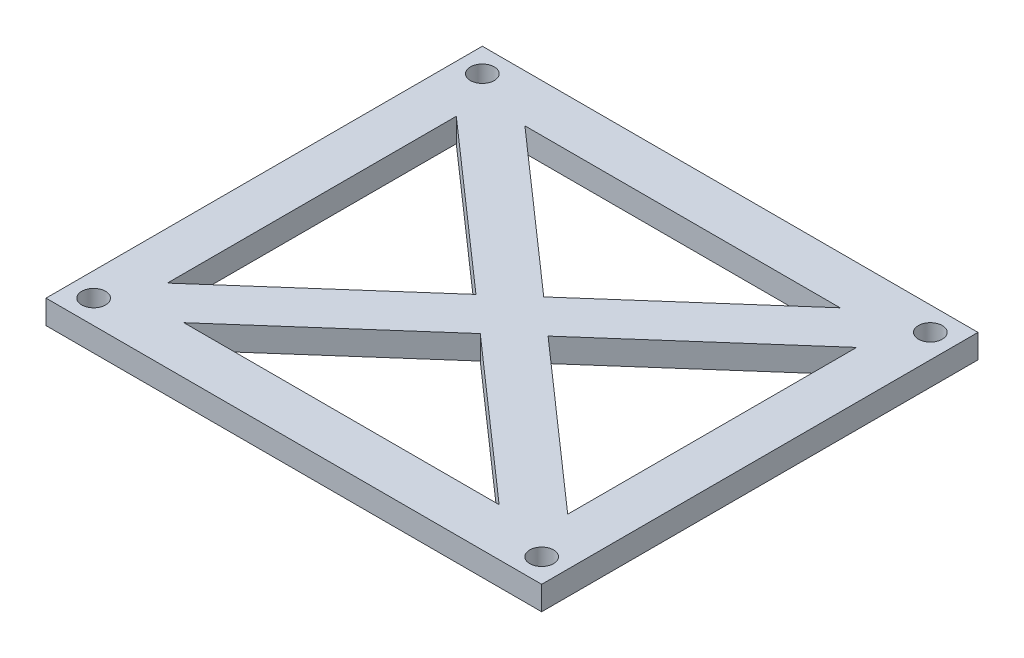
ISO-10303-21;
HEADER;
FILE_DESCRIPTION(('STEP AP214'),'2;1');
FILE_NAME('part.step','',(''),(''),'','','');
FILE_SCHEMA(('AUTOMOTIVE_DESIGN { 1 0 10303 214 1 1 1 1 }'));
ENDSEC;
DATA;
#1=APPLICATION_CONTEXT('core data for automotive mechanical design processes');
#2=APPLICATION_PROTOCOL_DEFINITION('international standard','automotive_design',2000,#1);
#3=PRODUCT_CONTEXT('',#1,'mechanical');
#4=PRODUCT('Part','Part','',(#3));
#5=PRODUCT_RELATED_PRODUCT_CATEGORY('part','',(#4));
#6=PRODUCT_DEFINITION_FORMATION('','',#4);
#7=PRODUCT_DEFINITION_CONTEXT('part definition',#1,'design');
#8=PRODUCT_DEFINITION('design','',#6,#7);
#9=PRODUCT_DEFINITION_SHAPE('','',#8);
#10=(LENGTH_UNIT() NAMED_UNIT(*) SI_UNIT(.MILLI.,.METRE.));
#11=(NAMED_UNIT(*) PLANE_ANGLE_UNIT() SI_UNIT($,.RADIAN.));
#12=(NAMED_UNIT(*) SI_UNIT($,.STERADIAN.) SOLID_ANGLE_UNIT());
#13=UNCERTAINTY_MEASURE_WITH_UNIT(LENGTH_MEASURE(1.E-05),#10,'distance_accuracy_value','');
#14=(GEOMETRIC_REPRESENTATION_CONTEXT(3) GLOBAL_UNCERTAINTY_ASSIGNED_CONTEXT((#13)) GLOBAL_UNIT_ASSIGNED_CONTEXT((#10,
#11,#12)) REPRESENTATION_CONTEXT('',''));
#15=CARTESIAN_POINT('',(0.,0.,0.));
#16=DIRECTION('',(0.,0.,1.));
#17=DIRECTION('',(1.,0.,0.));
#18=AXIS2_PLACEMENT_3D('',#15,#16,#17);
#19=CARTESIAN_POINT('',(0.,3.175,0.));
#20=DIRECTION('',(0.,-1.,0.));
#21=DIRECTION('',(0.,0.,-1.));
#22=AXIS2_PLACEMENT_3D('',#19,#20,#21);
#23=PLANE('',#22);
#24=DIRECTION('',(-0.75059916155882,0.,0.660757821495286));
#25=VECTOR('',#24,1.);
#26=CARTESIAN_POINT('',(-21.0015199796993,3.175,27.0432716513957));
#27=LINE('',#26,#25);
#28=CARTESIAN_POINT('',(0.,3.175,8.55548309450906));
#29=VERTEX_POINT('',#28);
#30=CARTESIAN_POINT('',(-21.0015199796993,3.175,27.0432716513957));
#31=VERTEX_POINT('',#30);
#32=EDGE_CURVE('E146',#29,#31,#27,.T.);
#33=ORIENTED_EDGE('',*,*,#32,.F.);
#34=DIRECTION('',(-0.75059916155882,0.,-0.660757821495286));
#35=VECTOR('',#34,1.);
#36=CARTESIAN_POINT('',(0.,3.175,8.55548309450906));
#37=LINE('',#36,#35);
#38=CARTESIAN_POINT('',(21.0015199796993,3.175,27.0432716513957));
#39=VERTEX_POINT('',#38);
#40=EDGE_CURVE('E164',#39,#29,#37,.T.);
#41=ORIENTED_EDGE('',*,*,#40,.F.);
#42=DIRECTION('',(1.,0.,0.));
#43=VECTOR('',#42,1.);
#44=CARTESIAN_POINT('',(21.0015199796993,3.175,27.0432716513957));
#45=LINE('',#44,#43);
#46=EDGE_CURVE('E154',#31,#39,#45,.T.);
#47=ORIENTED_EDGE('',*,*,#46,.F.);
#48=EDGE_LOOP('',(#33,#41,#47));
#49=FACE_BOUND('',#48,.T.);
#50=DIRECTION('',(0.,0.,-1.));
#51=VECTOR('',#50,1.);
#52=CARTESIAN_POINT('',(26.67,3.175,-14.9223090504777));
#53=LINE('',#52,#51);
#54=CARTESIAN_POINT('',(26.67,3.175,23.5733670418733));
#55=VERTEX_POINT('',#54);
#56=CARTESIAN_POINT('',(26.67,3.175,-14.9223090504777));
#57=VERTEX_POINT('',#56);
#58=EDGE_CURVE('E200',#55,#57,#53,.T.);
#59=ORIENTED_EDGE('',*,*,#58,.F.);
#60=DIRECTION('',(0.75059916155882,0.,0.660757821495286));
#61=VECTOR('',#60,1.);
#62=CARTESIAN_POINT('',(4.80508878852923,3.175,4.32552899569784));
#63=LINE('',#62,#61);
#64=CARTESIAN_POINT('',(4.80508878852923,3.175,4.32552899569784));
#65=VERTEX_POINT('',#64);
#66=EDGE_CURVE('E206',#65,#55,#63,.T.);
#67=ORIENTED_EDGE('',*,*,#66,.F.);
#68=DIRECTION('',(-0.75059916155882,0.,0.660757821495286));
#69=VECTOR('',#68,1.);
#70=CARTESIAN_POINT('',(4.80508878852923,3.175,4.32552899569784));
#71=LINE('',#70,#69);
#72=EDGE_CURVE('E202',#57,#65,#71,.T.);
#73=ORIENTED_EDGE('',*,*,#72,.F.);
#74=EDGE_LOOP('',(#59,#67,#73));
#75=FACE_BOUND('',#74,.T.);
#76=CARTESIAN_POINT('',(29.8449999999999,3.175,30.2182716513958));
#77=DIRECTION('',(0.,1.,0.));
#78=DIRECTION('',(0.,0.,1.));
#79=AXIS2_PLACEMENT_3D('',#76,#77,#78);
#80=CIRCLE('',#79,1.5875);
#81=CARTESIAN_POINT('',(29.8449999999999,3.175,31.8057716513958));
#82=VERTEX_POINT('',#81);
#83=EDGE_CURVE('E230',#82,#82,#80,.T.);
#84=ORIENTED_EDGE('',*,*,#83,.F.);
#85=EDGE_LOOP('',(#84));
#86=FACE_BOUND('',#85,.T.);
#87=CARTESIAN_POINT('',(29.8449999999999,3.175,-21.5672136600001));
#88=DIRECTION('',(0.,1.,0.));
#89=DIRECTION('',(0.,0.,-1.));
#90=AXIS2_PLACEMENT_3D('',#87,#88,#89);
#91=CIRCLE('',#90,1.5875);
#92=CARTESIAN_POINT('',(29.8449999999999,3.175,-23.1547136600001));
#93=VERTEX_POINT('',#92);
#94=EDGE_CURVE('E260',#93,#93,#91,.T.);
#95=ORIENTED_EDGE('',*,*,#94,.F.);
#96=EDGE_LOOP('',(#95));
#97=FACE_BOUND('',#96,.T.);
#98=DIRECTION('',(0.,0.,-1.));
#99=VECTOR('',#98,1.);
#100=CARTESIAN_POINT('',(33.02,3.175,-24.74221366));
#101=LINE('',#100,#99);
#102=CARTESIAN_POINT('',(33.02,3.175,33.3932716513957));
#103=VERTEX_POINT('',#102);
#104=CARTESIAN_POINT('',(33.02,3.175,-24.74221366));
#105=VERTEX_POINT('',#104);
#106=EDGE_CURVE('E266',#103,#105,#101,.T.);
#107=ORIENTED_EDGE('',*,*,#106,.T.);
#108=DIRECTION('',(-1.,0.,0.));
#109=VECTOR('',#108,1.);
#110=CARTESIAN_POINT('',(33.02,3.175,-24.74221366));
#111=LINE('',#110,#109);
#112=CARTESIAN_POINT('',(-33.02,3.175,-24.74221366));
#113=VERTEX_POINT('',#112);
#114=EDGE_CURVE('E269',#105,#113,#111,.T.);
#115=ORIENTED_EDGE('',*,*,#114,.T.);
#116=DIRECTION('',(0.,0.,1.));
#117=VECTOR('',#116,1.);
#118=CARTESIAN_POINT('',(-33.02,3.175,-24.74221366));
#119=LINE('',#118,#117);
#120=CARTESIAN_POINT('',(-33.02,3.175,33.3932716513957));
#121=VERTEX_POINT('',#120);
#122=EDGE_CURVE('E272',#113,#121,#119,.T.);
#123=ORIENTED_EDGE('',*,*,#122,.T.);
#124=DIRECTION('',(1.,0.,0.));
#125=VECTOR('',#124,1.);
#126=CARTESIAN_POINT('',(33.02,3.175,33.3932716513957));
#127=LINE('',#126,#125);
#128=EDGE_CURVE('E274',#121,#103,#127,.T.);
#129=ORIENTED_EDGE('',*,*,#128,.T.);
#130=EDGE_LOOP('',(#107,#115,#123,#129));
#131=FACE_BOUND('',#130,.T.);
#132=DIRECTION('',(-1.,0.,0.));
#133=VECTOR('',#132,1.);
#134=CARTESIAN_POINT('',(21.0015199796993,3.175,-18.39221366));
#135=LINE('',#134,#133);
#136=CARTESIAN_POINT('',(21.0015199796993,3.175,-18.39221366));
#137=VERTEX_POINT('',#136);
#138=CARTESIAN_POINT('',(-21.0015199796993,3.175,-18.39221366));
#139=VERTEX_POINT('',#138);
#140=EDGE_CURVE('E236',#137,#139,#135,.T.);
#141=ORIENTED_EDGE('',*,*,#140,.F.);
#142=DIRECTION('',(0.75059916155882,0.,-0.660757821495286));
#143=VECTOR('',#142,1.);
#144=CARTESIAN_POINT('',(0.,3.175,0.0955748968866129));
#145=LINE('',#144,#143);
#146=CARTESIAN_POINT('',(0.,3.175,0.0955748968866129));
#147=VERTEX_POINT('',#146);
#148=EDGE_CURVE('E242',#147,#137,#145,.T.);
#149=ORIENTED_EDGE('',*,*,#148,.F.);
#150=DIRECTION('',(0.75059916155882,0.,0.660757821495286));
#151=VECTOR('',#150,1.);
#152=CARTESIAN_POINT('',(-21.0015199796993,3.175,-18.39221366));
#153=LINE('',#152,#151);
#154=EDGE_CURVE('E238',#139,#147,#153,.T.);
#155=ORIENTED_EDGE('',*,*,#154,.F.);
#156=EDGE_LOOP('',(#141,#149,#155));
#157=FACE_BOUND('',#156,.T.);
#158=CARTESIAN_POINT('',(-29.845,3.175,-21.56721366));
#159=DIRECTION('',(0.,1.,0.));
#160=DIRECTION('',(0.,0.,1.));
#161=AXIS2_PLACEMENT_3D('',#158,#159,#160);
#162=CIRCLE('',#161,1.58750000000001);
#163=CARTESIAN_POINT('',(-29.845,3.175,-19.97971366));
#164=VERTEX_POINT('',#163);
#165=EDGE_CURVE('E224',#164,#164,#162,.T.);
#166=ORIENTED_EDGE('',*,*,#165,.F.);
#167=EDGE_LOOP('',(#166));
#168=FACE_BOUND('',#167,.T.);
#169=DIRECTION('',(-0.75059916155882,0.,-0.660757821495286));
#170=VECTOR('',#169,1.);
#171=CARTESIAN_POINT('',(-26.67,3.175,-14.9223090504776));
#172=LINE('',#171,#170);
#173=CARTESIAN_POINT('',(-4.80508878852924,3.175,4.32552899569783));
#174=VERTEX_POINT('',#173);
#175=CARTESIAN_POINT('',(-26.67,3.175,-14.9223090504776));
#176=VERTEX_POINT('',#175);
#177=EDGE_CURVE('E176',#174,#176,#172,.T.);
#178=ORIENTED_EDGE('',*,*,#177,.F.);
#179=DIRECTION('',(0.75059916155882,0.,-0.660757821495286));
#180=VECTOR('',#179,1.);
#181=CARTESIAN_POINT('',(-26.67,3.175,23.5733670418733));
#182=LINE('',#181,#180);
#183=CARTESIAN_POINT('',(-26.67,3.175,23.5733670418733));
#184=VERTEX_POINT('',#183);
#185=EDGE_CURVE('E182',#184,#174,#182,.T.);
#186=ORIENTED_EDGE('',*,*,#185,.F.);
#187=DIRECTION('',(0.,0.,1.));
#188=VECTOR('',#187,1.);
#189=CARTESIAN_POINT('',(-26.67,3.175,-14.9223090504776));
#190=LINE('',#189,#188);
#191=EDGE_CURVE('E178',#176,#184,#190,.T.);
#192=ORIENTED_EDGE('',*,*,#191,.F.);
#193=EDGE_LOOP('',(#178,#186,#192));
#194=FACE_BOUND('',#193,.T.);
#195=CARTESIAN_POINT('',(-29.845,3.175,30.2182716513956));
#196=DIRECTION('',(0.,1.,0.));
#197=DIRECTION('',(0.,0.,-1.));
#198=AXIS2_PLACEMENT_3D('',#195,#196,#197);
#199=CIRCLE('',#198,1.58750000000001);
#200=CARTESIAN_POINT('',(-29.845,3.175,28.6307716513956));
#201=VERTEX_POINT('',#200);
#202=EDGE_CURVE('E170',#201,#201,#199,.T.);
#203=ORIENTED_EDGE('',*,*,#202,.F.);
#204=EDGE_LOOP('',(#203));
#205=FACE_BOUND('',#204,.T.);
#206=ADVANCED_FACE('F33',(#49,#75,#86,#97,#131,#157,#168,#194,#205),#23,.F.);
#207=CARTESIAN_POINT('',(0.,0.,0.));
#208=DIRECTION('',(0.,-1.,0.));
#209=DIRECTION('',(0.,0.,-1.));
#210=AXIS2_PLACEMENT_3D('',#207,#208,#209);
#211=PLANE('',#210);
#212=DIRECTION('',(-0.75059916155882,0.,-0.660757821495286));
#213=VECTOR('',#212,1.);
#214=CARTESIAN_POINT('',(0.,0.,8.55548309450906));
#215=LINE('',#214,#213);
#216=CARTESIAN_POINT('',(21.0015199796993,0.,27.0432716513957));
#217=VERTEX_POINT('',#216);
#218=CARTESIAN_POINT('',(0.,0.,8.55548309450906));
#219=VERTEX_POINT('',#218);
#220=EDGE_CURVE('E155',#217,#219,#215,.T.);
#221=ORIENTED_EDGE('',*,*,#220,.T.);
#222=DIRECTION('',(-0.75059916155882,0.,0.660757821495286));
#223=VECTOR('',#222,1.);
#224=CARTESIAN_POINT('',(-21.0015199796993,0.,27.0432716513957));
#225=LINE('',#224,#223);
#226=CARTESIAN_POINT('',(-21.0015199796993,0.,27.0432716513957));
#227=VERTEX_POINT('',#226);
#228=EDGE_CURVE('E56',#219,#227,#225,.T.);
#229=ORIENTED_EDGE('',*,*,#228,.T.);
#230=DIRECTION('',(1.,0.,0.));
#231=VECTOR('',#230,1.);
#232=CARTESIAN_POINT('',(21.0015199796993,0.,27.0432716513957));
#233=LINE('',#232,#231);
#234=EDGE_CURVE('E160',#227,#217,#233,.T.);
#235=ORIENTED_EDGE('',*,*,#234,.T.);
#236=EDGE_LOOP('',(#221,#229,#235));
#237=FACE_BOUND('',#236,.T.);
#238=DIRECTION('',(0.75059916155882,0.,0.660757821495286));
#239=VECTOR('',#238,1.);
#240=CARTESIAN_POINT('',(4.80508878852923,0.,4.32552899569784));
#241=LINE('',#240,#239);
#242=CARTESIAN_POINT('',(4.80508878852923,0.,4.32552899569784));
#243=VERTEX_POINT('',#242);
#244=CARTESIAN_POINT('',(26.67,0.,23.5733670418733));
#245=VERTEX_POINT('',#244);
#246=EDGE_CURVE('E203',#243,#245,#241,.T.);
#247=ORIENTED_EDGE('',*,*,#246,.T.);
#248=DIRECTION('',(0.,0.,-1.));
#249=VECTOR('',#248,1.);
#250=CARTESIAN_POINT('',(26.67,0.,-14.9223090504777));
#251=LINE('',#250,#249);
#252=CARTESIAN_POINT('',(26.67,0.,-14.9223090504777));
#253=VERTEX_POINT('',#252);
#254=EDGE_CURVE('E199',#245,#253,#251,.T.);
#255=ORIENTED_EDGE('',*,*,#254,.T.);
#256=DIRECTION('',(-0.75059916155882,0.,0.660757821495286));
#257=VECTOR('',#256,1.);
#258=CARTESIAN_POINT('',(4.80508878852923,0.,4.32552899569784));
#259=LINE('',#258,#257);
#260=EDGE_CURVE('E211',#253,#243,#259,.T.);
#261=ORIENTED_EDGE('',*,*,#260,.T.);
#262=EDGE_LOOP('',(#247,#255,#261));
#263=FACE_BOUND('',#262,.T.);
#264=CARTESIAN_POINT('',(29.8449999999999,0.,30.2182716513958));
#265=DIRECTION('',(0.,1.,0.));
#266=DIRECTION('',(0.,0.,1.));
#267=AXIS2_PLACEMENT_3D('',#264,#265,#266);
#268=CIRCLE('',#267,1.5875);
#269=CARTESIAN_POINT('',(29.8449999999999,0.,31.8057716513958));
#270=VERTEX_POINT('',#269);
#271=EDGE_CURVE('E227',#270,#270,#268,.T.);
#272=ORIENTED_EDGE('',*,*,#271,.T.);
#273=EDGE_LOOP('',(#272));
#274=FACE_BOUND('',#273,.T.);
#275=CARTESIAN_POINT('',(29.8449999999999,0.,-21.5672136600001));
#276=DIRECTION('',(0.,1.,0.));
#277=DIRECTION('',(0.,0.,-1.));
#278=AXIS2_PLACEMENT_3D('',#275,#276,#277);
#279=CIRCLE('',#278,1.5875);
#280=CARTESIAN_POINT('',(29.8449999999999,0.,-23.1547136600001));
#281=VERTEX_POINT('',#280);
#282=EDGE_CURVE('E259',#281,#281,#279,.T.);
#283=ORIENTED_EDGE('',*,*,#282,.T.);
#284=EDGE_LOOP('',(#283));
#285=FACE_BOUND('',#284,.T.);
#286=DIRECTION('',(0.,0.,-1.));
#287=VECTOR('',#286,1.);
#288=CARTESIAN_POINT('',(33.02,0.,-24.74221366));
#289=LINE('',#288,#287);
#290=CARTESIAN_POINT('',(33.02,0.,33.3932716513957));
#291=VERTEX_POINT('',#290);
#292=CARTESIAN_POINT('',(33.02,0.,-24.74221366));
#293=VERTEX_POINT('',#292);
#294=EDGE_CURVE('E263',#291,#293,#289,.T.);
#295=ORIENTED_EDGE('',*,*,#294,.F.);
#296=DIRECTION('',(1.,0.,0.));
#297=VECTOR('',#296,1.);
#298=CARTESIAN_POINT('',(33.02,0.,33.3932716513957));
#299=LINE('',#298,#297);
#300=CARTESIAN_POINT('',(-33.02,0.,33.3932716513957));
#301=VERTEX_POINT('',#300);
#302=EDGE_CURVE('E270',#301,#291,#299,.T.);
#303=ORIENTED_EDGE('',*,*,#302,.F.);
#304=DIRECTION('',(0.,0.,1.));
#305=VECTOR('',#304,1.);
#306=CARTESIAN_POINT('',(-33.02,0.,-24.74221366));
#307=LINE('',#306,#305);
#308=CARTESIAN_POINT('',(-33.02,0.,-24.74221366));
#309=VERTEX_POINT('',#308);
#310=EDGE_CURVE('E281',#309,#301,#307,.T.);
#311=ORIENTED_EDGE('',*,*,#310,.F.);
#312=DIRECTION('',(-1.,0.,0.));
#313=VECTOR('',#312,1.);
#314=CARTESIAN_POINT('',(33.02,0.,-24.74221366));
#315=LINE('',#314,#313);
#316=EDGE_CURVE('E279',#293,#309,#315,.T.);
#317=ORIENTED_EDGE('',*,*,#316,.F.);
#318=EDGE_LOOP('',(#295,#303,#311,#317));
#319=FACE_BOUND('',#318,.T.);
#320=DIRECTION('',(0.75059916155882,0.,-0.660757821495286));
#321=VECTOR('',#320,1.);
#322=CARTESIAN_POINT('',(0.,0.,0.0955748968866129));
#323=LINE('',#322,#321);
#324=CARTESIAN_POINT('',(0.,0.,0.0955748968866129));
#325=VERTEX_POINT('',#324);
#326=CARTESIAN_POINT('',(21.0015199796993,0.,-18.39221366));
#327=VERTEX_POINT('',#326);
#328=EDGE_CURVE('E239',#325,#327,#323,.T.);
#329=ORIENTED_EDGE('',*,*,#328,.T.);
#330=DIRECTION('',(-1.,0.,0.));
#331=VECTOR('',#330,1.);
#332=CARTESIAN_POINT('',(21.0015199796993,0.,-18.39221366));
#333=LINE('',#332,#331);
#334=CARTESIAN_POINT('',(-21.0015199796993,0.,-18.39221366));
#335=VERTEX_POINT('',#334);
#336=EDGE_CURVE('E233',#327,#335,#333,.T.);
#337=ORIENTED_EDGE('',*,*,#336,.T.);
#338=DIRECTION('',(0.75059916155882,0.,0.660757821495286));
#339=VECTOR('',#338,1.);
#340=CARTESIAN_POINT('',(-21.0015199796993,0.,-18.39221366));
#341=LINE('',#340,#339);
#342=EDGE_CURVE('E247',#335,#325,#341,.T.);
#343=ORIENTED_EDGE('',*,*,#342,.T.);
#344=EDGE_LOOP('',(#329,#337,#343));
#345=FACE_BOUND('',#344,.T.);
#346=CARTESIAN_POINT('',(-29.845,0.,-21.56721366));
#347=DIRECTION('',(0.,1.,0.));
#348=DIRECTION('',(0.,0.,1.));
#349=AXIS2_PLACEMENT_3D('',#346,#347,#348);
#350=CIRCLE('',#349,1.58750000000001);
#351=CARTESIAN_POINT('',(-29.845,0.,-19.97971366));
#352=VERTEX_POINT('',#351);
#353=EDGE_CURVE('E223',#352,#352,#350,.T.);
#354=ORIENTED_EDGE('',*,*,#353,.T.);
#355=EDGE_LOOP('',(#354));
#356=FACE_BOUND('',#355,.T.);
#357=DIRECTION('',(0.75059916155882,0.,-0.660757821495286));
#358=VECTOR('',#357,1.);
#359=CARTESIAN_POINT('',(-26.67,0.,23.5733670418733));
#360=LINE('',#359,#358);
#361=CARTESIAN_POINT('',(-26.67,0.,23.5733670418733));
#362=VERTEX_POINT('',#361);
#363=CARTESIAN_POINT('',(-4.80508878852924,0.,4.32552899569783));
#364=VERTEX_POINT('',#363);
#365=EDGE_CURVE('E179',#362,#364,#360,.T.);
#366=ORIENTED_EDGE('',*,*,#365,.T.);
#367=DIRECTION('',(-0.75059916155882,0.,-0.660757821495286));
#368=VECTOR('',#367,1.);
#369=CARTESIAN_POINT('',(-26.67,0.,-14.9223090504776));
#370=LINE('',#369,#368);
#371=CARTESIAN_POINT('',(-26.67,0.,-14.9223090504776));
#372=VERTEX_POINT('',#371);
#373=EDGE_CURVE('E161',#364,#372,#370,.T.);
#374=ORIENTED_EDGE('',*,*,#373,.T.);
#375=DIRECTION('',(0.,0.,1.));
#376=VECTOR('',#375,1.);
#377=CARTESIAN_POINT('',(-26.67,0.,-14.9223090504776));
#378=LINE('',#377,#376);
#379=EDGE_CURVE('E187',#372,#362,#378,.T.);
#380=ORIENTED_EDGE('',*,*,#379,.T.);
#381=EDGE_LOOP('',(#366,#374,#380));
#382=FACE_BOUND('',#381,.T.);
#383=CARTESIAN_POINT('',(-29.845,0.,30.2182716513956));
#384=DIRECTION('',(0.,1.,0.));
#385=DIRECTION('',(0.,0.,-1.));
#386=AXIS2_PLACEMENT_3D('',#383,#384,#385);
#387=CIRCLE('',#386,1.58750000000001);
#388=CARTESIAN_POINT('',(-29.845,0.,28.6307716513956));
#389=VERTEX_POINT('',#388);
#390=EDGE_CURVE('E403',#389,#389,#387,.T.);
#391=ORIENTED_EDGE('',*,*,#390,.T.);
#392=EDGE_LOOP('',(#391));
#393=FACE_BOUND('',#392,.T.);
#394=ADVANCED_FACE('F299',(#237,#263,#274,#285,#319,#345,#356,#382,#393),#211,.T.);
#395=CARTESIAN_POINT('',(33.02,3.175,-24.74221366));
#396=DIRECTION('',(-1.,0.,0.));
#397=DIRECTION('',(0.,0.,1.));
#398=AXIS2_PLACEMENT_3D('',#395,#396,#397);
#399=PLANE('',#398);
#400=ORIENTED_EDGE('',*,*,#294,.T.);
#401=DIRECTION('',(0.,-1.,0.));
#402=VECTOR('',#401,1.);
#403=CARTESIAN_POINT('',(33.02,3.175,-24.74221366));
#404=LINE('',#403,#402);
#405=EDGE_CURVE('E11',#105,#293,#404,.T.);
#406=ORIENTED_EDGE('',*,*,#405,.F.);
#407=ORIENTED_EDGE('',*,*,#106,.F.);
#408=DIRECTION('',(0.,-1.,0.));
#409=VECTOR('',#408,1.);
#410=CARTESIAN_POINT('',(33.02,3.175,33.3932716513957));
#411=LINE('',#410,#409);
#412=EDGE_CURVE('E276',#103,#291,#411,.T.);
#413=ORIENTED_EDGE('',*,*,#412,.T.);
#414=EDGE_LOOP('',(#400,#406,#407,#413));
#415=FACE_BOUND('',#414,.T.);
#416=ADVANCED_FACE('F35',(#415),#399,.F.);
#417=CARTESIAN_POINT('',(33.02,3.175,-24.74221366));
#418=DIRECTION('',(0.,0.,1.));
#419=DIRECTION('',(1.,0.,0.));
#420=AXIS2_PLACEMENT_3D('',#417,#418,#419);
#421=PLANE('',#420);
#422=ORIENTED_EDGE('',*,*,#316,.T.);
#423=DIRECTION('',(0.,-1.,0.));
#424=VECTOR('',#423,1.);
#425=CARTESIAN_POINT('',(-33.02,3.175,-24.74221366));
#426=LINE('',#425,#424);
#427=EDGE_CURVE('E41',#113,#309,#426,.T.);
#428=ORIENTED_EDGE('',*,*,#427,.F.);
#429=ORIENTED_EDGE('',*,*,#114,.F.);
#430=ORIENTED_EDGE('',*,*,#405,.T.);
#431=EDGE_LOOP('',(#422,#428,#429,#430));
#432=FACE_BOUND('',#431,.T.);
#433=ADVANCED_FACE('F310',(#432),#421,.F.);
#434=CARTESIAN_POINT('',(-33.02,3.175,-24.74221366));
#435=DIRECTION('',(1.,0.,0.));
#436=DIRECTION('',(0.,0.,-1.));
#437=AXIS2_PLACEMENT_3D('',#434,#435,#436);
#438=PLANE('',#437);
#439=ORIENTED_EDGE('',*,*,#310,.T.);
#440=DIRECTION('',(0.,-1.,0.));
#441=VECTOR('',#440,1.);
#442=CARTESIAN_POINT('',(-33.02,3.175,33.3932716513957));
#443=LINE('',#442,#441);
#444=EDGE_CURVE('E286',#121,#301,#443,.T.);
#445=ORIENTED_EDGE('',*,*,#444,.F.);
#446=ORIENTED_EDGE('',*,*,#122,.F.);
#447=ORIENTED_EDGE('',*,*,#427,.T.);
#448=EDGE_LOOP('',(#439,#445,#446,#447));
#449=FACE_BOUND('',#448,.T.);
#450=ADVANCED_FACE('F293',(#449),#438,.F.);
#451=CARTESIAN_POINT('',(33.02,3.175,33.3932716513957));
#452=DIRECTION('',(0.,0.,-1.));
#453=DIRECTION('',(-1.,0.,0.));
#454=AXIS2_PLACEMENT_3D('',#451,#452,#453);
#455=PLANE('',#454);
#456=ORIENTED_EDGE('',*,*,#302,.T.);
#457=ORIENTED_EDGE('',*,*,#412,.F.);
#458=ORIENTED_EDGE('',*,*,#128,.F.);
#459=ORIENTED_EDGE('',*,*,#444,.T.);
#460=EDGE_LOOP('',(#456,#457,#458,#459));
#461=FACE_BOUND('',#460,.T.);
#462=ADVANCED_FACE('F303',(#461),#455,.F.);
#463=CARTESIAN_POINT('',(29.8449999999999,3.175,-21.5672136600001));
#464=DIRECTION('',(0.,-1.,0.));
#465=DIRECTION('',(0.,0.,-1.));
#466=AXIS2_PLACEMENT_3D('',#463,#464,#465);
#467=CYLINDRICAL_SURFACE('',#466,1.5875);
#468=ORIENTED_EDGE('',*,*,#94,.T.);
#469=EDGE_LOOP('',(#468));
#470=FACE_BOUND('',#469,.T.);
#471=ORIENTED_EDGE('',*,*,#282,.F.);
#472=EDGE_LOOP('',(#471));
#473=FACE_BOUND('',#472,.T.);
#474=ADVANCED_FACE('F325',(#470,#473),#467,.F.);
#475=CARTESIAN_POINT('',(21.0015199796993,3.175,-18.39221366));
#476=DIRECTION('',(0.,0.,1.));
#477=DIRECTION('',(1.,0.,0.));
#478=AXIS2_PLACEMENT_3D('',#475,#476,#477);
#479=PLANE('',#478);
#480=ORIENTED_EDGE('',*,*,#336,.F.);
#481=DIRECTION('',(0.,-1.,0.));
#482=VECTOR('',#481,1.);
#483=CARTESIAN_POINT('',(21.0015199796993,3.175,-18.39221366));
#484=LINE('',#483,#482);
#485=EDGE_CURVE('E244',#137,#327,#484,.T.);
#486=ORIENTED_EDGE('',*,*,#485,.F.);
#487=ORIENTED_EDGE('',*,*,#140,.T.);
#488=DIRECTION('',(0.,-1.,0.));
#489=VECTOR('',#488,1.);
#490=CARTESIAN_POINT('',(-21.0015199796993,3.175,-18.39221366));
#491=LINE('',#490,#489);
#492=EDGE_CURVE('E256',#139,#335,#491,.T.);
#493=ORIENTED_EDGE('',*,*,#492,.T.);
#494=EDGE_LOOP('',(#480,#486,#487,#493));
#495=FACE_BOUND('',#494,.T.);
#496=ADVANCED_FACE('F332',(#495),#479,.T.);
#497=CARTESIAN_POINT('',(-21.0015199796993,3.175,-18.39221366));
#498=DIRECTION('',(0.660757821495286,0.,-0.75059916155882));
#499=DIRECTION('',(-0.75059916155882,0.,-0.660757821495286));
#500=AXIS2_PLACEMENT_3D('',#497,#498,#499);
#501=PLANE('',#500);
#502=ORIENTED_EDGE('',*,*,#342,.F.);
#503=ORIENTED_EDGE('',*,*,#492,.F.);
#504=ORIENTED_EDGE('',*,*,#154,.T.);
#505=DIRECTION('',(0.,-1.,0.));
#506=VECTOR('',#505,1.);
#507=CARTESIAN_POINT('',(0.,3.175,0.0955748968866129));
#508=LINE('',#507,#506);
#509=EDGE_CURVE('E254',#147,#325,#508,.T.);
#510=ORIENTED_EDGE('',*,*,#509,.T.);
#511=EDGE_LOOP('',(#502,#503,#504,#510));
#512=FACE_BOUND('',#511,.T.);
#513=ADVANCED_FACE('F337',(#512),#501,.T.);
#514=CARTESIAN_POINT('',(0.,3.175,0.0955748968866129));
#515=DIRECTION('',(-0.660757821495286,0.,-0.75059916155882));
#516=DIRECTION('',(-0.75059916155882,0.,0.660757821495286));
#517=AXIS2_PLACEMENT_3D('',#514,#515,#516);
#518=PLANE('',#517);
#519=ORIENTED_EDGE('',*,*,#328,.F.);
#520=ORIENTED_EDGE('',*,*,#509,.F.);
#521=ORIENTED_EDGE('',*,*,#148,.T.);
#522=ORIENTED_EDGE('',*,*,#485,.T.);
#523=EDGE_LOOP('',(#519,#520,#521,#522));
#524=FACE_BOUND('',#523,.T.);
#525=ADVANCED_FACE('F347',(#524),#518,.T.);
#526=CARTESIAN_POINT('',(29.8449999999999,3.175,30.2182716513958));
#527=DIRECTION('',(0.,-1.,0.));
#528=DIRECTION('',(0.,0.,-1.));
#529=AXIS2_PLACEMENT_3D('',#526,#527,#528);
#530=CYLINDRICAL_SURFACE('',#529,1.5875);
#531=ORIENTED_EDGE('',*,*,#83,.T.);
#532=EDGE_LOOP('',(#531));
#533=FACE_BOUND('',#532,.T.);
#534=ORIENTED_EDGE('',*,*,#271,.F.);
#535=EDGE_LOOP('',(#534));
#536=FACE_BOUND('',#535,.T.);
#537=ADVANCED_FACE('F353',(#533,#536),#530,.F.);
#538=CARTESIAN_POINT('',(-29.845,3.175,-21.56721366));
#539=DIRECTION('',(0.,-1.,0.));
#540=DIRECTION('',(0.,0.,-1.));
#541=AXIS2_PLACEMENT_3D('',#538,#539,#540);
#542=CYLINDRICAL_SURFACE('',#541,1.58750000000001);
#543=ORIENTED_EDGE('',*,*,#165,.T.);
#544=EDGE_LOOP('',(#543));
#545=FACE_BOUND('',#544,.T.);
#546=ORIENTED_EDGE('',*,*,#353,.F.);
#547=EDGE_LOOP('',(#546));
#548=FACE_BOUND('',#547,.T.);
#549=ADVANCED_FACE('F357',(#545,#548),#542,.F.);
#550=CARTESIAN_POINT('',(26.67,3.175,-14.9223090504777));
#551=DIRECTION('',(-1.,0.,0.));
#552=DIRECTION('',(0.,0.,1.));
#553=AXIS2_PLACEMENT_3D('',#550,#551,#552);
#554=PLANE('',#553);
#555=ORIENTED_EDGE('',*,*,#254,.F.);
#556=DIRECTION('',(0.,-1.,0.));
#557=VECTOR('',#556,1.);
#558=CARTESIAN_POINT('',(26.67,3.175,23.5733670418733));
#559=LINE('',#558,#557);
#560=EDGE_CURVE('E208',#55,#245,#559,.T.);
#561=ORIENTED_EDGE('',*,*,#560,.F.);
#562=ORIENTED_EDGE('',*,*,#58,.T.);
#563=DIRECTION('',(0.,-1.,0.));
#564=VECTOR('',#563,1.);
#565=CARTESIAN_POINT('',(26.67,3.175,-14.9223090504777));
#566=LINE('',#565,#564);
#567=EDGE_CURVE('E220',#57,#253,#566,.T.);
#568=ORIENTED_EDGE('',*,*,#567,.T.);
#569=EDGE_LOOP('',(#555,#561,#562,#568));
#570=FACE_BOUND('',#569,.T.);
#571=ADVANCED_FACE('F361',(#570),#554,.T.);
#572=CARTESIAN_POINT('',(4.80508878852923,3.175,4.32552899569784));
#573=DIRECTION('',(0.660757821495286,0.,0.75059916155882));
#574=DIRECTION('',(0.75059916155882,0.,-0.660757821495286));
#575=AXIS2_PLACEMENT_3D('',#572,#573,#574);
#576=PLANE('',#575);
#577=ORIENTED_EDGE('',*,*,#260,.F.);
#578=ORIENTED_EDGE('',*,*,#567,.F.);
#579=ORIENTED_EDGE('',*,*,#72,.T.);
#580=DIRECTION('',(0.,-1.,0.));
#581=VECTOR('',#580,1.);
#582=CARTESIAN_POINT('',(4.80508878852923,3.175,4.32552899569784));
#583=LINE('',#582,#581);
#584=EDGE_CURVE('E218',#65,#243,#583,.T.);
#585=ORIENTED_EDGE('',*,*,#584,.T.);
#586=EDGE_LOOP('',(#577,#578,#579,#585));
#587=FACE_BOUND('',#586,.T.);
#588=ADVANCED_FACE('F365',(#587),#576,.T.);
#589=CARTESIAN_POINT('',(4.80508878852923,3.175,4.32552899569784));
#590=DIRECTION('',(0.660757821495286,0.,-0.75059916155882));
#591=DIRECTION('',(-0.75059916155882,0.,-0.660757821495286));
#592=AXIS2_PLACEMENT_3D('',#589,#590,#591);
#593=PLANE('',#592);
#594=ORIENTED_EDGE('',*,*,#246,.F.);
#595=ORIENTED_EDGE('',*,*,#584,.F.);
#596=ORIENTED_EDGE('',*,*,#66,.T.);
#597=ORIENTED_EDGE('',*,*,#560,.T.);
#598=EDGE_LOOP('',(#594,#595,#596,#597));
#599=FACE_BOUND('',#598,.T.);
#600=ADVANCED_FACE('F369',(#599),#593,.T.);
#601=CARTESIAN_POINT('',(-26.67,3.175,-14.9223090504776));
#602=DIRECTION('',(-0.660757821495286,0.,0.75059916155882));
#603=DIRECTION('',(0.75059916155882,0.,0.660757821495286));
#604=AXIS2_PLACEMENT_3D('',#601,#602,#603);
#605=PLANE('',#604);
#606=ORIENTED_EDGE('',*,*,#373,.F.);
#607=DIRECTION('',(0.,-1.,0.));
#608=VECTOR('',#607,1.);
#609=CARTESIAN_POINT('',(-4.80508878852924,3.175,4.32552899569783));
#610=LINE('',#609,#608);
#611=EDGE_CURVE('E184',#174,#364,#610,.T.);
#612=ORIENTED_EDGE('',*,*,#611,.F.);
#613=ORIENTED_EDGE('',*,*,#177,.T.);
#614=DIRECTION('',(0.,-1.,0.));
#615=VECTOR('',#614,1.);
#616=CARTESIAN_POINT('',(-26.67,3.175,-14.9223090504776));
#617=LINE('',#616,#615);
#618=EDGE_CURVE('E196',#176,#372,#617,.T.);
#619=ORIENTED_EDGE('',*,*,#618,.T.);
#620=EDGE_LOOP('',(#606,#612,#613,#619));
#621=FACE_BOUND('',#620,.T.);
#622=ADVANCED_FACE('F373',(#621),#605,.T.);
#623=CARTESIAN_POINT('',(-26.67,3.175,-14.9223090504776));
#624=DIRECTION('',(1.,0.,0.));
#625=DIRECTION('',(0.,0.,-1.));
#626=AXIS2_PLACEMENT_3D('',#623,#624,#625);
#627=PLANE('',#626);
#628=ORIENTED_EDGE('',*,*,#379,.F.);
#629=ORIENTED_EDGE('',*,*,#618,.F.);
#630=ORIENTED_EDGE('',*,*,#191,.T.);
#631=DIRECTION('',(0.,-1.,0.));
#632=VECTOR('',#631,1.);
#633=CARTESIAN_POINT('',(-26.67,3.175,23.5733670418733));
#634=LINE('',#633,#632);
#635=EDGE_CURVE('E194',#184,#362,#634,.T.);
#636=ORIENTED_EDGE('',*,*,#635,.T.);
#637=EDGE_LOOP('',(#628,#629,#630,#636));
#638=FACE_BOUND('',#637,.T.);
#639=ADVANCED_FACE('F377',(#638),#627,.T.);
#640=CARTESIAN_POINT('',(-26.67,3.175,23.5733670418733));
#641=DIRECTION('',(-0.660757821495286,0.,-0.75059916155882));
#642=DIRECTION('',(-0.75059916155882,0.,0.660757821495286));
#643=AXIS2_PLACEMENT_3D('',#640,#641,#642);
#644=PLANE('',#643);
#645=ORIENTED_EDGE('',*,*,#365,.F.);
#646=ORIENTED_EDGE('',*,*,#635,.F.);
#647=ORIENTED_EDGE('',*,*,#185,.T.);
#648=ORIENTED_EDGE('',*,*,#611,.T.);
#649=EDGE_LOOP('',(#645,#646,#647,#648));
#650=FACE_BOUND('',#649,.T.);
#651=ADVANCED_FACE('F381',(#650),#644,.T.);
#652=CARTESIAN_POINT('',(-21.0015199796993,3.175,27.0432716513957));
#653=DIRECTION('',(0.660757821495286,0.,0.75059916155882));
#654=DIRECTION('',(0.75059916155882,0.,-0.660757821495286));
#655=AXIS2_PLACEMENT_3D('',#652,#653,#654);
#656=PLANE('',#655);
#657=ORIENTED_EDGE('',*,*,#228,.F.);
#658=DIRECTION('',(0.,-1.,0.));
#659=VECTOR('',#658,1.);
#660=CARTESIAN_POINT('',(0.,3.175,8.55548309450906));
#661=LINE('',#660,#659);
#662=EDGE_CURVE('E150',#29,#219,#661,.T.);
#663=ORIENTED_EDGE('',*,*,#662,.F.);
#664=ORIENTED_EDGE('',*,*,#32,.T.);
#665=DIRECTION('',(0.,-1.,0.));
#666=VECTOR('',#665,1.);
#667=CARTESIAN_POINT('',(-21.0015199796993,3.175,27.0432716513957));
#668=LINE('',#667,#666);
#669=EDGE_CURVE('E149',#31,#227,#668,.T.);
#670=ORIENTED_EDGE('',*,*,#669,.T.);
#671=EDGE_LOOP('',(#657,#663,#664,#670));
#672=FACE_BOUND('',#671,.T.);
#673=ADVANCED_FACE('F148',(#672),#656,.T.);
#674=CARTESIAN_POINT('',(21.0015199796993,3.175,27.0432716513957));
#675=DIRECTION('',(0.,0.,-1.));
#676=DIRECTION('',(-1.,0.,0.));
#677=AXIS2_PLACEMENT_3D('',#674,#675,#676);
#678=PLANE('',#677);
#679=ORIENTED_EDGE('',*,*,#234,.F.);
#680=ORIENTED_EDGE('',*,*,#669,.F.);
#681=ORIENTED_EDGE('',*,*,#46,.T.);
#682=DIRECTION('',(0.,-1.,0.));
#683=VECTOR('',#682,1.);
#684=CARTESIAN_POINT('',(21.0015199796993,3.175,27.0432716513957));
#685=LINE('',#684,#683);
#686=EDGE_CURVE('E48',#39,#217,#685,.T.);
#687=ORIENTED_EDGE('',*,*,#686,.T.);
#688=EDGE_LOOP('',(#679,#680,#681,#687));
#689=FACE_BOUND('',#688,.T.);
#690=ADVANCED_FACE('F158',(#689),#678,.T.);
#691=CARTESIAN_POINT('',(0.,3.175,8.55548309450906));
#692=DIRECTION('',(-0.660757821495286,0.,0.75059916155882));
#693=DIRECTION('',(0.75059916155882,0.,0.660757821495286));
#694=AXIS2_PLACEMENT_3D('',#691,#692,#693);
#695=PLANE('',#694);
#696=ORIENTED_EDGE('',*,*,#220,.F.);
#697=ORIENTED_EDGE('',*,*,#686,.F.);
#698=ORIENTED_EDGE('',*,*,#40,.T.);
#699=ORIENTED_EDGE('',*,*,#662,.T.);
#700=EDGE_LOOP('',(#696,#697,#698,#699));
#701=FACE_BOUND('',#700,.T.);
#702=ADVANCED_FACE('F390',(#701),#695,.T.);
#703=CARTESIAN_POINT('',(-29.845,3.175,30.2182716513956));
#704=DIRECTION('',(0.,-1.,0.));
#705=DIRECTION('',(0.,0.,-1.));
#706=AXIS2_PLACEMENT_3D('',#703,#704,#705);
#707=CYLINDRICAL_SURFACE('',#706,1.58750000000001);
#708=ORIENTED_EDGE('',*,*,#202,.T.);
#709=EDGE_LOOP('',(#708));
#710=FACE_BOUND('',#709,.T.);
#711=ORIENTED_EDGE('',*,*,#390,.F.);
#712=EDGE_LOOP('',(#711));
#713=FACE_BOUND('',#712,.T.);
#714=ADVANCED_FACE('F393',(#710,#713),#707,.F.);
#715=CLOSED_SHELL('',(#206,#394,#416,#433,#450,#462,#474,#496,#513,#525,#537,#549,#571,#588,
#600,#622,#639,#651,#673,#690,#702,#714));
#716=MANIFOLD_SOLID_BREP('B2',#715);
#717=ADVANCED_BREP_SHAPE_REPRESENTATION('',(#18,#716),#14);
#718=SHAPE_DEFINITION_REPRESENTATION(#9,#717);
ENDSEC;
END-ISO-10303-21;
